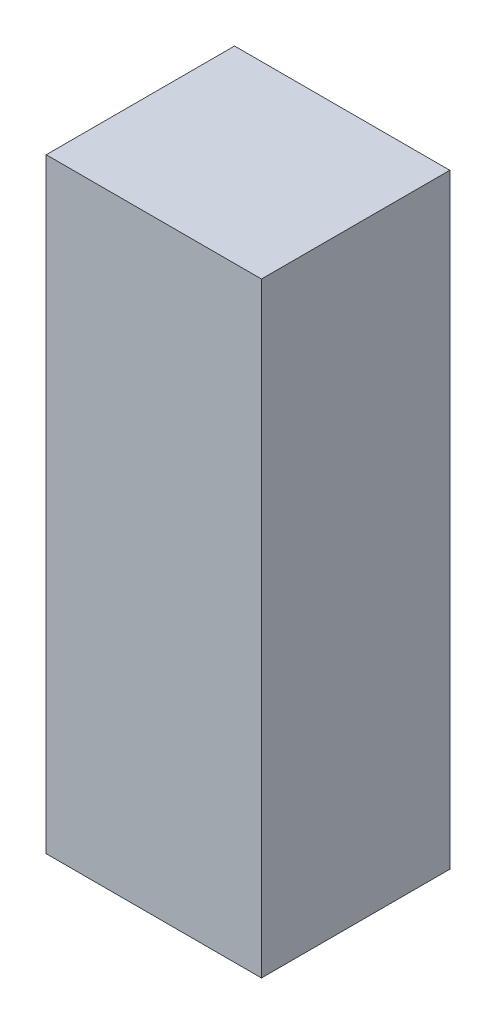
ISO-10303-21;
HEADER;
FILE_DESCRIPTION(('STEP AP214'),'2;1');
FILE_NAME('part.step','',(''),(''),'','','');
FILE_SCHEMA(('AUTOMOTIVE_DESIGN { 1 0 10303 214 1 1 1 1 }'));
ENDSEC;
DATA;
#1=APPLICATION_CONTEXT('core data for automotive mechanical design processes');
#2=APPLICATION_PROTOCOL_DEFINITION('international standard','automotive_design',2000,#1);
#3=PRODUCT_CONTEXT('',#1,'mechanical');
#4=PRODUCT('Part','Part','',(#3));
#5=PRODUCT_RELATED_PRODUCT_CATEGORY('part','',(#4));
#6=PRODUCT_DEFINITION_FORMATION('','',#4);
#7=PRODUCT_DEFINITION_CONTEXT('part definition',#1,'design');
#8=PRODUCT_DEFINITION('design','',#6,#7);
#9=PRODUCT_DEFINITION_SHAPE('','',#8);
#10=(LENGTH_UNIT() NAMED_UNIT(*) SI_UNIT(.MILLI.,.METRE.));
#11=(NAMED_UNIT(*) PLANE_ANGLE_UNIT() SI_UNIT($,.RADIAN.));
#12=(NAMED_UNIT(*) SI_UNIT($,.STERADIAN.) SOLID_ANGLE_UNIT());
#13=UNCERTAINTY_MEASURE_WITH_UNIT(LENGTH_MEASURE(1.E-05),#10,'distance_accuracy_value','');
#14=(GEOMETRIC_REPRESENTATION_CONTEXT(3) GLOBAL_UNCERTAINTY_ASSIGNED_CONTEXT((#13)) GLOBAL_UNIT_ASSIGNED_CONTEXT((#10,
#11,#12)) REPRESENTATION_CONTEXT('',''));
#15=CARTESIAN_POINT('',(0.,0.,0.));
#16=DIRECTION('',(0.,0.,1.));
#17=DIRECTION('',(1.,0.,0.));
#18=AXIS2_PLACEMENT_3D('',#15,#16,#17);
#19=CARTESIAN_POINT('',(-14.6734181773657,57.15,-25.4598339029345));
#20=DIRECTION('',(-1.,0.,0.));
#21=DIRECTION('',(0.,0.,1.));
#22=AXIS2_PLACEMENT_3D('',#19,#20,#21);
#23=PLANE('',#22);
#24=DIRECTION('',(0.,0.,-1.));
#25=VECTOR('',#24,1.);
#26=CARTESIAN_POINT('',(-14.6734181773657,0.,-25.4598339029345));
#27=LINE('',#26,#25);
#28=CARTESIAN_POINT('',(-14.6734181773657,0.,-25.4598339029345));
#29=VERTEX_POINT('',#28);
#30=CARTESIAN_POINT('',(-14.6734181773657,0.,-43.2398339029345));
#31=VERTEX_POINT('',#30);
#32=EDGE_CURVE('E114',#29,#31,#27,.T.);
#33=ORIENTED_EDGE('',*,*,#32,.T.);
#34=DIRECTION('',(0.,-1.,0.));
#35=VECTOR('',#34,1.);
#36=CARTESIAN_POINT('',(-14.6734181773657,57.15,-43.2398339029345));
#37=LINE('',#36,#35);
#38=CARTESIAN_POINT('',(-14.6734181773657,57.15,-43.2398339029345));
#39=VERTEX_POINT('',#38);
#40=EDGE_CURVE('E11',#39,#31,#37,.T.);
#41=ORIENTED_EDGE('',*,*,#40,.F.);
#42=DIRECTION('',(0.,0.,-1.));
#43=VECTOR('',#42,1.);
#44=CARTESIAN_POINT('',(-14.6734181773657,57.15,-25.4598339029345));
#45=LINE('',#44,#43);
#46=CARTESIAN_POINT('',(-14.6734181773657,57.15,-25.4598339029345));
#47=VERTEX_POINT('',#46);
#48=EDGE_CURVE('E100',#47,#39,#45,.T.);
#49=ORIENTED_EDGE('',*,*,#48,.F.);
#50=DIRECTION('',(0.,-1.,0.));
#51=VECTOR('',#50,1.);
#52=CARTESIAN_POINT('',(-14.6734181773657,57.15,-25.4598339029345));
#53=LINE('',#52,#51);
#54=EDGE_CURVE('E108',#47,#29,#53,.T.);
#55=ORIENTED_EDGE('',*,*,#54,.T.);
#56=EDGE_LOOP('',(#33,#41,#49,#55));
#57=FACE_BOUND('',#56,.T.);
#58=ADVANCED_FACE('F44',(#57),#23,.F.);
#59=CARTESIAN_POINT('',(-34.9934181773657,57.15,-43.2398339029345));
#60=DIRECTION('',(0.,0.,1.));
#61=DIRECTION('',(1.,0.,0.));
#62=AXIS2_PLACEMENT_3D('',#59,#60,#61);
#63=PLANE('',#62);
#64=DIRECTION('',(-1.,0.,0.));
#65=VECTOR('',#64,1.);
#66=CARTESIAN_POINT('',(-34.9934181773657,0.,-43.2398339029345));
#67=LINE('',#66,#65);
#68=CARTESIAN_POINT('',(-34.9934181773657,0.,-43.2398339029345));
#69=VERTEX_POINT('',#68);
#70=EDGE_CURVE('E105',#31,#69,#67,.T.);
#71=ORIENTED_EDGE('',*,*,#70,.T.);
#72=DIRECTION('',(0.,-1.,0.));
#73=VECTOR('',#72,1.);
#74=CARTESIAN_POINT('',(-34.9934181773657,57.15,-43.2398339029345));
#75=LINE('',#74,#73);
#76=CARTESIAN_POINT('',(-34.9934181773657,57.15,-43.2398339029345));
#77=VERTEX_POINT('',#76);
#78=EDGE_CURVE('E53',#77,#69,#75,.T.);
#79=ORIENTED_EDGE('',*,*,#78,.F.);
#80=DIRECTION('',(-1.,0.,0.));
#81=VECTOR('',#80,1.);
#82=CARTESIAN_POINT('',(-34.9934181773657,57.15,-43.2398339029345));
#83=LINE('',#82,#81);
#84=EDGE_CURVE('E95',#39,#77,#83,.T.);
#85=ORIENTED_EDGE('',*,*,#84,.F.);
#86=ORIENTED_EDGE('',*,*,#40,.T.);
#87=EDGE_LOOP('',(#71,#79,#85,#86));
#88=FACE_BOUND('',#87,.T.);
#89=ADVANCED_FACE('F101',(#88),#63,.F.);
#90=CARTESIAN_POINT('',(-34.9934181773657,57.15,-25.4598339029345));
#91=DIRECTION('',(1.,0.,0.));
#92=DIRECTION('',(0.,0.,-1.));
#93=AXIS2_PLACEMENT_3D('',#90,#91,#92);
#94=PLANE('',#93);
#95=DIRECTION('',(0.,0.,1.));
#96=VECTOR('',#95,1.);
#97=CARTESIAN_POINT('',(-34.9934181773657,0.,-25.4598339029345));
#98=LINE('',#97,#96);
#99=CARTESIAN_POINT('',(-34.9934181773657,0.,-25.4598339029345));
#100=VERTEX_POINT('',#99);
#101=EDGE_CURVE('E78',#69,#100,#98,.T.);
#102=ORIENTED_EDGE('',*,*,#101,.T.);
#103=DIRECTION('',(0.,-1.,0.));
#104=VECTOR('',#103,1.);
#105=CARTESIAN_POINT('',(-34.9934181773657,57.15,-25.4598339029345));
#106=LINE('',#105,#104);
#107=CARTESIAN_POINT('',(-34.9934181773657,57.15,-25.4598339029345));
#108=VERTEX_POINT('',#107);
#109=EDGE_CURVE('E102',#108,#100,#106,.T.);
#110=ORIENTED_EDGE('',*,*,#109,.F.);
#111=DIRECTION('',(0.,0.,1.));
#112=VECTOR('',#111,1.);
#113=CARTESIAN_POINT('',(-34.9934181773657,57.15,-25.4598339029345));
#114=LINE('',#113,#112);
#115=EDGE_CURVE('E92',#77,#108,#114,.T.);
#116=ORIENTED_EDGE('',*,*,#115,.F.);
#117=ORIENTED_EDGE('',*,*,#78,.T.);
#118=EDGE_LOOP('',(#102,#110,#116,#117));
#119=FACE_BOUND('',#118,.T.);
#120=ADVANCED_FACE('F104',(#119),#94,.F.);
#121=CARTESIAN_POINT('',(-34.9934181773657,57.15,-25.4598339029345));
#122=DIRECTION('',(0.,0.,-1.));
#123=DIRECTION('',(-1.,0.,0.));
#124=AXIS2_PLACEMENT_3D('',#121,#122,#123);
#125=PLANE('',#124);
#126=DIRECTION('',(1.,0.,0.));
#127=VECTOR('',#126,1.);
#128=CARTESIAN_POINT('',(-34.9934181773657,0.,-25.4598339029345));
#129=LINE('',#128,#127);
#130=EDGE_CURVE('E84',#100,#29,#129,.T.);
#131=ORIENTED_EDGE('',*,*,#130,.T.);
#132=ORIENTED_EDGE('',*,*,#54,.F.);
#133=DIRECTION('',(1.,0.,0.));
#134=VECTOR('',#133,1.);
#135=CARTESIAN_POINT('',(-34.9934181773657,57.15,-25.4598339029345));
#136=LINE('',#135,#134);
#137=EDGE_CURVE('E62',#108,#47,#136,.T.);
#138=ORIENTED_EDGE('',*,*,#137,.F.);
#139=ORIENTED_EDGE('',*,*,#109,.T.);
#140=EDGE_LOOP('',(#131,#132,#138,#139));
#141=FACE_BOUND('',#140,.T.);
#142=ADVANCED_FACE('F127',(#141),#125,.F.);
#143=CARTESIAN_POINT('',(0.,57.15,0.));
#144=DIRECTION('',(0.,-1.,0.));
#145=DIRECTION('',(0.,0.,-1.));
#146=AXIS2_PLACEMENT_3D('',#143,#144,#145);
#147=PLANE('',#146);
#148=ORIENTED_EDGE('',*,*,#48,.T.);
#149=ORIENTED_EDGE('',*,*,#84,.T.);
#150=ORIENTED_EDGE('',*,*,#115,.T.);
#151=ORIENTED_EDGE('',*,*,#137,.T.);
#152=EDGE_LOOP('',(#148,#149,#150,#151));
#153=FACE_BOUND('',#152,.T.);
#154=ADVANCED_FACE('F91',(#153),#147,.F.);
#155=CARTESIAN_POINT('',(0.,0.,0.));
#156=DIRECTION('',(0.,-1.,0.));
#157=DIRECTION('',(0.,0.,-1.));
#158=AXIS2_PLACEMENT_3D('',#155,#156,#157);
#159=PLANE('',#158);
#160=ORIENTED_EDGE('',*,*,#32,.F.);
#161=ORIENTED_EDGE('',*,*,#130,.F.);
#162=ORIENTED_EDGE('',*,*,#101,.F.);
#163=ORIENTED_EDGE('',*,*,#70,.F.);
#164=EDGE_LOOP('',(#160,#161,#162,#163));
#165=FACE_BOUND('',#164,.T.);
#166=ADVANCED_FACE('F129',(#165),#159,.T.);
#167=CLOSED_SHELL('',(#58,#89,#120,#142,#154,#166));
#168=MANIFOLD_SOLID_BREP('B2',#167);
#169=ADVANCED_BREP_SHAPE_REPRESENTATION('',(#18,#168),#14);
#170=SHAPE_DEFINITION_REPRESENTATION(#9,#169);
ENDSEC;
END-ISO-10303-21;
